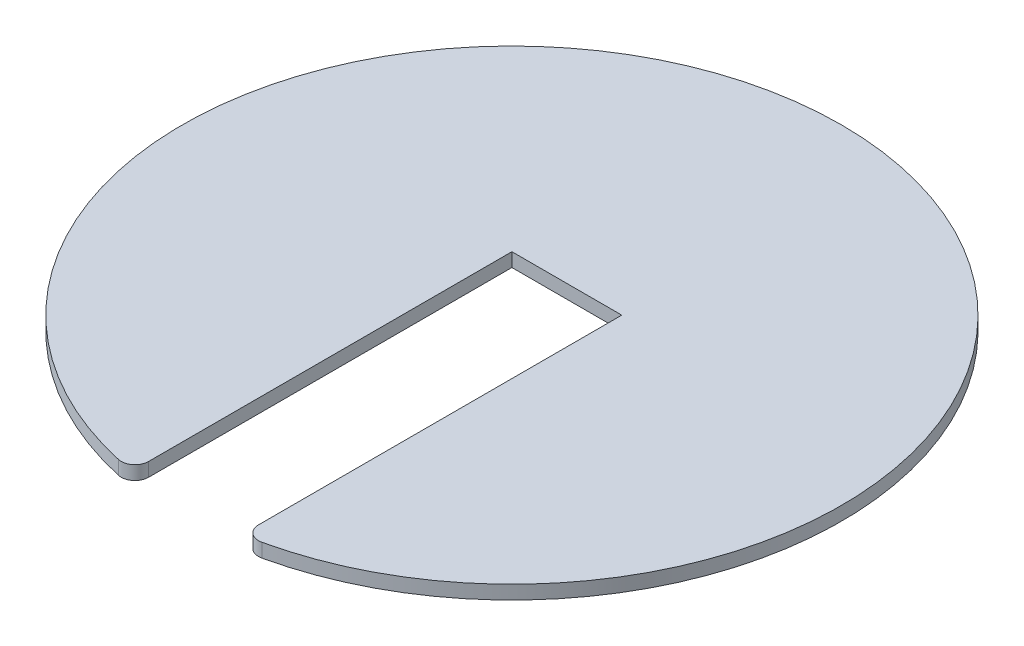
ISO-10303-21;
HEADER;
FILE_DESCRIPTION(('STEP AP214'),'2;1');
FILE_NAME('part.step','',(''),(''),'','','');
FILE_SCHEMA(('AUTOMOTIVE_DESIGN { 1 0 10303 214 1 1 1 1 }'));
ENDSEC;
DATA;
#1=APPLICATION_CONTEXT('core data for automotive mechanical design processes');
#2=APPLICATION_PROTOCOL_DEFINITION('international standard','automotive_design',2000,#1);
#3=PRODUCT_CONTEXT('',#1,'mechanical');
#4=PRODUCT('Part','Part','',(#3));
#5=PRODUCT_RELATED_PRODUCT_CATEGORY('part','',(#4));
#6=PRODUCT_DEFINITION_FORMATION('','',#4);
#7=PRODUCT_DEFINITION_CONTEXT('part definition',#1,'design');
#8=PRODUCT_DEFINITION('design','',#6,#7);
#9=PRODUCT_DEFINITION_SHAPE('','',#8);
#10=(LENGTH_UNIT() NAMED_UNIT(*) SI_UNIT(.MILLI.,.METRE.));
#11=(NAMED_UNIT(*) PLANE_ANGLE_UNIT() SI_UNIT($,.RADIAN.));
#12=(NAMED_UNIT(*) SI_UNIT($,.STERADIAN.) SOLID_ANGLE_UNIT());
#13=UNCERTAINTY_MEASURE_WITH_UNIT(LENGTH_MEASURE(1.E-05),#10,'distance_accuracy_value','');
#14=(GEOMETRIC_REPRESENTATION_CONTEXT(3) GLOBAL_UNCERTAINTY_ASSIGNED_CONTEXT((#13)) GLOBAL_UNIT_ASSIGNED_CONTEXT((#10,
#11,#12)) REPRESENTATION_CONTEXT('',''));
#15=CARTESIAN_POINT('',(0.,0.,0.));
#16=DIRECTION('',(0.,0.,1.));
#17=DIRECTION('',(1.,0.,0.));
#18=AXIS2_PLACEMENT_3D('',#15,#16,#17);
#19=CARTESIAN_POINT('',(0.,0.,0.));
#20=DIRECTION('',(0.,1.,0.));
#21=DIRECTION('',(0.,0.,1.));
#22=AXIS2_PLACEMENT_3D('',#19,#20,#21);
#23=PLANE('',#22);
#24=CARTESIAN_POINT('',(31.75,0.,142.557146436089));
#25=DIRECTION('',(0.,-1.,0.));
#26=DIRECTION('',(0.,0.,-1.));
#27=AXIS2_PLACEMENT_3D('',#24,#25,#26);
#28=CIRCLE('',#27,6.35);
#29=CARTESIAN_POINT('',(25.4,0.,142.557146436089));
#30=VERTEX_POINT('',#29);
#31=CARTESIAN_POINT('',(33.1304347826091,0.,148.755283237657));
#32=VERTEX_POINT('',#31);
#33=EDGE_CURVE('E36',#30,#32,#28,.F.);
#34=ORIENTED_EDGE('',*,*,#33,.F.);
#35=DIRECTION('',(0.,0.,-1.));
#36=VECTOR('',#35,1.);
#37=CARTESIAN_POINT('',(25.4,0.,0.));
#38=LINE('',#37,#36);
#39=CARTESIAN_POINT('',(25.4,0.,-25.4));
#40=VERTEX_POINT('',#39);
#41=EDGE_CURVE('E81',#30,#40,#38,.T.);
#42=ORIENTED_EDGE('',*,*,#41,.T.);
#43=DIRECTION('',(-1.,0.,0.));
#44=VECTOR('',#43,1.);
#45=CARTESIAN_POINT('',(0.,0.,-25.4));
#46=LINE('',#45,#44);
#47=CARTESIAN_POINT('',(-25.4,0.,-25.4));
#48=VERTEX_POINT('',#47);
#49=EDGE_CURVE('E112',#40,#48,#46,.T.);
#50=ORIENTED_EDGE('',*,*,#49,.T.);
#51=DIRECTION('',(0.,0.,-1.));
#52=VECTOR('',#51,1.);
#53=CARTESIAN_POINT('',(-25.4,0.,0.));
#54=LINE('',#53,#52);
#55=CARTESIAN_POINT('',(-25.4,0.,142.557146436089));
#56=VERTEX_POINT('',#55);
#57=EDGE_CURVE('E123',#56,#48,#54,.T.);
#58=ORIENTED_EDGE('',*,*,#57,.F.);
#59=CARTESIAN_POINT('',(-31.75,0.,142.557146436089));
#60=DIRECTION('',(0.,-1.,0.));
#61=DIRECTION('',(0.,0.,-1.));
#62=AXIS2_PLACEMENT_3D('',#59,#60,#61);
#63=CIRCLE('',#62,6.35);
#64=CARTESIAN_POINT('',(-33.1304347825849,0.,148.755283237663));
#65=VERTEX_POINT('',#64);
#66=EDGE_CURVE('E97',#65,#56,#63,.F.);
#67=ORIENTED_EDGE('',*,*,#66,.F.);
#68=CARTESIAN_POINT('',(0.,0.,0.));
#69=DIRECTION('',(0.,-1.,0.));
#70=DIRECTION('',(0.,0.,-1.));
#71=AXIS2_PLACEMENT_3D('',#68,#69,#70);
#72=CIRCLE('',#71,152.4);
#73=EDGE_CURVE('E95',#32,#65,#72,.F.);
#74=ORIENTED_EDGE('',*,*,#73,.F.);
#75=EDGE_LOOP('',(#34,#42,#50,#58,#67,#74));
#76=FACE_BOUND('',#75,.T.);
#77=ADVANCED_FACE('F33',(#76),#23,.F.);
#78=CARTESIAN_POINT('',(25.4,6.35,0.));
#79=DIRECTION('',(1.,0.,0.));
#80=DIRECTION('',(0.,0.,-1.));
#81=AXIS2_PLACEMENT_3D('',#78,#79,#80);
#82=PLANE('',#81);
#83=DIRECTION('',(0.,-1.,0.));
#84=VECTOR('',#83,1.);
#85=CARTESIAN_POINT('',(25.4,6.35,142.557146436089));
#86=LINE('',#85,#84);
#87=CARTESIAN_POINT('',(25.4,6.35,142.557146436089));
#88=VERTEX_POINT('',#87);
#89=EDGE_CURVE('E92',#88,#30,#86,.T.);
#90=ORIENTED_EDGE('',*,*,#89,.F.);
#91=DIRECTION('',(0.,0.,1.));
#92=VECTOR('',#91,1.);
#93=CARTESIAN_POINT('',(25.4,6.35,0.));
#94=LINE('',#93,#92);
#95=CARTESIAN_POINT('',(25.4,6.35,-25.4));
#96=VERTEX_POINT('',#95);
#97=EDGE_CURVE('E120',#96,#88,#94,.T.);
#98=ORIENTED_EDGE('',*,*,#97,.F.);
#99=DIRECTION('',(0.,1.,0.));
#100=VECTOR('',#99,1.);
#101=CARTESIAN_POINT('',(25.4,6.35,-25.4));
#102=LINE('',#101,#100);
#103=EDGE_CURVE('E110',#96,#40,#102,.F.);
#104=ORIENTED_EDGE('',*,*,#103,.T.);
#105=ORIENTED_EDGE('',*,*,#41,.F.);
#106=EDGE_LOOP('',(#90,#98,#104,#105));
#107=FACE_BOUND('',#106,.T.);
#108=ADVANCED_FACE('F159',(#107),#82,.F.);
#109=CARTESIAN_POINT('',(31.75,6.35,142.557146436089));
#110=DIRECTION('',(0.,-1.,0.));
#111=DIRECTION('',(0.,0.,-1.));
#112=AXIS2_PLACEMENT_3D('',#109,#110,#111);
#113=CYLINDRICAL_SURFACE('',#112,6.35);
#114=ORIENTED_EDGE('',*,*,#33,.T.);
#115=DIRECTION('',(0.,-1.,0.));
#116=VECTOR('',#115,1.);
#117=CARTESIAN_POINT('',(33.1304347826095,6.35,148.755283237656));
#118=LINE('',#117,#116);
#119=CARTESIAN_POINT('',(33.1304347826088,6.35,148.755283237656));
#120=VERTEX_POINT('',#119);
#121=EDGE_CURVE('E90',#120,#32,#118,.T.);
#122=ORIENTED_EDGE('',*,*,#121,.F.);
#123=CARTESIAN_POINT('',(31.75,6.35,142.557146436089));
#124=DIRECTION('',(0.,-1.,0.));
#125=DIRECTION('',(0.,0.,-1.));
#126=AXIS2_PLACEMENT_3D('',#123,#124,#125);
#127=CIRCLE('',#126,6.35);
#128=EDGE_CURVE('E132',#88,#120,#127,.F.);
#129=ORIENTED_EDGE('',*,*,#128,.F.);
#130=ORIENTED_EDGE('',*,*,#89,.T.);
#131=EDGE_LOOP('',(#114,#122,#129,#130));
#132=FACE_BOUND('',#131,.T.);
#133=ADVANCED_FACE('F87',(#132),#113,.T.);
#134=CARTESIAN_POINT('',(0.,6.35,0.));
#135=DIRECTION('',(0.,-1.,0.));
#136=DIRECTION('',(0.,0.,-1.));
#137=AXIS2_PLACEMENT_3D('',#134,#135,#136);
#138=CYLINDRICAL_SURFACE('',#137,152.4);
#139=ORIENTED_EDGE('',*,*,#73,.T.);
#140=DIRECTION('',(0.,-1.,0.));
#141=VECTOR('',#140,1.);
#142=CARTESIAN_POINT('',(-33.1304347825616,6.35,148.755283237669));
#143=LINE('',#142,#141);
#144=CARTESIAN_POINT('',(-33.1304347825851,6.35,148.755283237664));
#145=VERTEX_POINT('',#144);
#146=EDGE_CURVE('E100',#145,#65,#143,.T.);
#147=ORIENTED_EDGE('',*,*,#146,.F.);
#148=CARTESIAN_POINT('',(0.,6.35,0.));
#149=DIRECTION('',(0.,-1.,0.));
#150=DIRECTION('',(0.,0.,-1.));
#151=AXIS2_PLACEMENT_3D('',#148,#149,#150);
#152=CIRCLE('',#151,152.4);
#153=EDGE_CURVE('E103',#120,#145,#152,.F.);
#154=ORIENTED_EDGE('',*,*,#153,.F.);
#155=ORIENTED_EDGE('',*,*,#121,.T.);
#156=EDGE_LOOP('',(#139,#147,#154,#155));
#157=FACE_BOUND('',#156,.T.);
#158=ADVANCED_FACE('F101',(#157),#138,.T.);
#159=CARTESIAN_POINT('',(-31.75,6.35,142.557146436089));
#160=DIRECTION('',(0.,-1.,0.));
#161=DIRECTION('',(0.,0.,-1.));
#162=AXIS2_PLACEMENT_3D('',#159,#160,#161);
#163=CYLINDRICAL_SURFACE('',#162,6.35);
#164=ORIENTED_EDGE('',*,*,#66,.T.);
#165=DIRECTION('',(0.,1.,0.));
#166=VECTOR('',#165,1.);
#167=CARTESIAN_POINT('',(-25.4,6.35,142.557146436089));
#168=LINE('',#167,#166);
#169=CARTESIAN_POINT('',(-25.4,6.35,142.557146436089));
#170=VERTEX_POINT('',#169);
#171=EDGE_CURVE('E125',#170,#56,#168,.F.);
#172=ORIENTED_EDGE('',*,*,#171,.F.);
#173=CARTESIAN_POINT('',(-31.75,6.35,142.557146436089));
#174=DIRECTION('',(0.,-1.,0.));
#175=DIRECTION('',(0.,0.,-1.));
#176=AXIS2_PLACEMENT_3D('',#173,#174,#175);
#177=CIRCLE('',#176,6.35);
#178=EDGE_CURVE('E128',#145,#170,#177,.F.);
#179=ORIENTED_EDGE('',*,*,#178,.F.);
#180=ORIENTED_EDGE('',*,*,#146,.T.);
#181=EDGE_LOOP('',(#164,#172,#179,#180));
#182=FACE_BOUND('',#181,.T.);
#183=ADVANCED_FACE('F138',(#182),#163,.T.);
#184=CARTESIAN_POINT('',(-25.4,6.35,0.));
#185=DIRECTION('',(1.,0.,0.));
#186=DIRECTION('',(0.,0.,-1.));
#187=AXIS2_PLACEMENT_3D('',#184,#185,#186);
#188=PLANE('',#187);
#189=ORIENTED_EDGE('',*,*,#57,.T.);
#190=DIRECTION('',(0.,1.,0.));
#191=VECTOR('',#190,1.);
#192=CARTESIAN_POINT('',(-25.4,6.35,-25.4));
#193=LINE('',#192,#191);
#194=CARTESIAN_POINT('',(-25.4,6.35,-25.4));
#195=VERTEX_POINT('',#194);
#196=EDGE_CURVE('E51',#48,#195,#193,.T.);
#197=ORIENTED_EDGE('',*,*,#196,.T.);
#198=DIRECTION('',(0.,0.,1.));
#199=VECTOR('',#198,1.);
#200=CARTESIAN_POINT('',(-25.4,6.35,0.));
#201=LINE('',#200,#199);
#202=EDGE_CURVE('E42',#170,#195,#201,.F.);
#203=ORIENTED_EDGE('',*,*,#202,.F.);
#204=ORIENTED_EDGE('',*,*,#171,.T.);
#205=EDGE_LOOP('',(#189,#197,#203,#204));
#206=FACE_BOUND('',#205,.T.);
#207=ADVANCED_FACE('F155',(#206),#188,.T.);
#208=CARTESIAN_POINT('',(0.,6.35,-25.4));
#209=DIRECTION('',(0.,0.,-1.));
#210=DIRECTION('',(-1.,0.,0.));
#211=AXIS2_PLACEMENT_3D('',#208,#209,#210);
#212=PLANE('',#211);
#213=ORIENTED_EDGE('',*,*,#103,.F.);
#214=DIRECTION('',(1.,0.,0.));
#215=VECTOR('',#214,1.);
#216=CARTESIAN_POINT('',(0.,6.35,-25.4));
#217=LINE('',#216,#215);
#218=EDGE_CURVE('E11',#195,#96,#217,.T.);
#219=ORIENTED_EDGE('',*,*,#218,.F.);
#220=ORIENTED_EDGE('',*,*,#196,.F.);
#221=ORIENTED_EDGE('',*,*,#49,.F.);
#222=EDGE_LOOP('',(#213,#219,#220,#221));
#223=FACE_BOUND('',#222,.T.);
#224=ADVANCED_FACE('F158',(#223),#212,.F.);
#225=CARTESIAN_POINT('',(0.,6.35,0.));
#226=DIRECTION('',(0.,1.,0.));
#227=DIRECTION('',(0.,0.,1.));
#228=AXIS2_PLACEMENT_3D('',#225,#226,#227);
#229=PLANE('',#228);
#230=ORIENTED_EDGE('',*,*,#202,.T.);
#231=ORIENTED_EDGE('',*,*,#218,.T.);
#232=ORIENTED_EDGE('',*,*,#97,.T.);
#233=ORIENTED_EDGE('',*,*,#128,.T.);
#234=ORIENTED_EDGE('',*,*,#153,.T.);
#235=ORIENTED_EDGE('',*,*,#178,.T.);
#236=EDGE_LOOP('',(#230,#231,#232,#233,#234,#235));
#237=FACE_BOUND('',#236,.T.);
#238=ADVANCED_FACE('F141',(#237),#229,.T.);
#239=CLOSED_SHELL('',(#77,#108,#133,#158,#183,#207,#224,#238));
#240=MANIFOLD_SOLID_BREP('B2',#239);
#241=ADVANCED_BREP_SHAPE_REPRESENTATION('',(#18,#240),#14);
#242=SHAPE_DEFINITION_REPRESENTATION(#9,#241);
ENDSEC;
END-ISO-10303-21;
